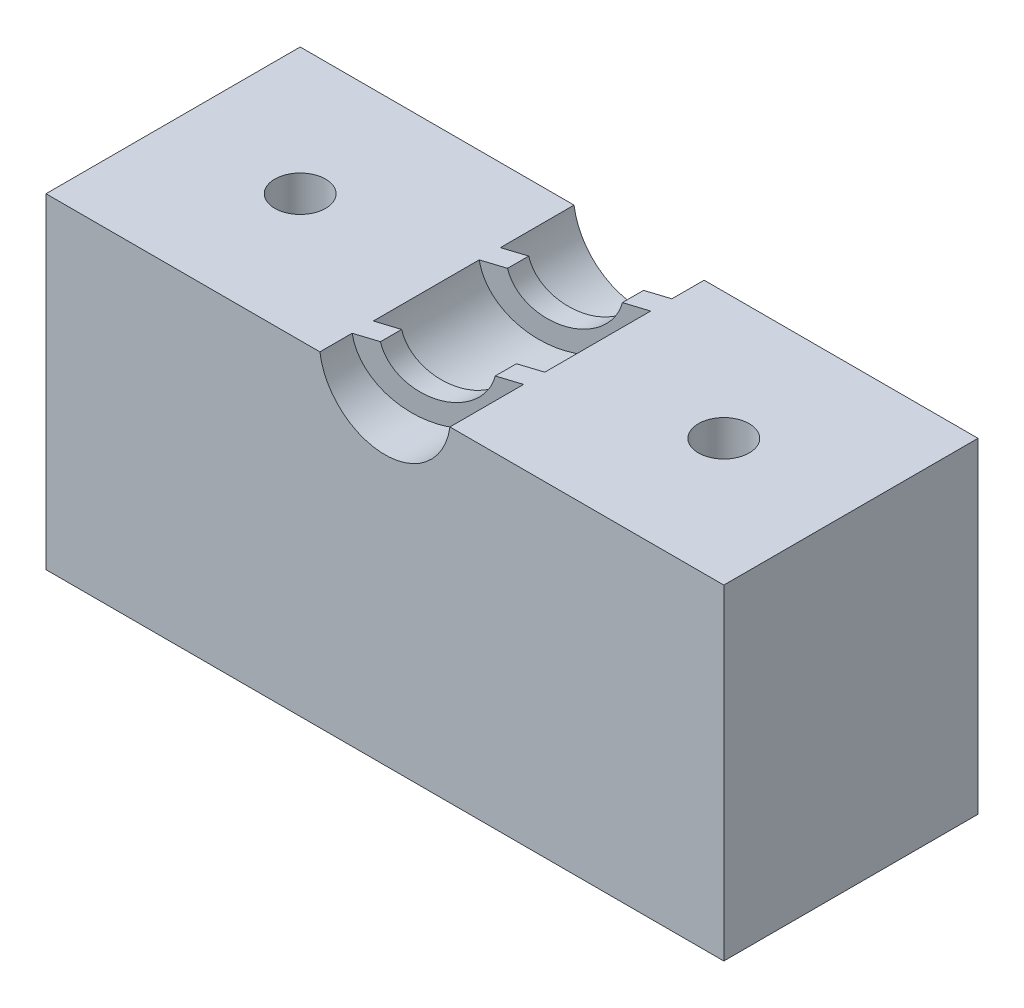
ISO-10303-21;
HEADER;
FILE_DESCRIPTION(('STEP AP214'),'2;1');
FILE_NAME('part.step','',(''),(''),'','','');
FILE_SCHEMA(('AUTOMOTIVE_DESIGN { 1 0 10303 214 1 1 1 1 }'));
ENDSEC;
DATA;
#1=APPLICATION_CONTEXT('core data for automotive mechanical design processes');
#2=APPLICATION_PROTOCOL_DEFINITION('international standard','automotive_design',2000,#1);
#3=PRODUCT_CONTEXT('',#1,'mechanical');
#4=PRODUCT('Part','Part','',(#3));
#5=PRODUCT_RELATED_PRODUCT_CATEGORY('part','',(#4));
#6=PRODUCT_DEFINITION_FORMATION('','',#4);
#7=PRODUCT_DEFINITION_CONTEXT('part definition',#1,'design');
#8=PRODUCT_DEFINITION('design','',#6,#7);
#9=PRODUCT_DEFINITION_SHAPE('','',#8);
#10=(LENGTH_UNIT() NAMED_UNIT(*) SI_UNIT(.MILLI.,.METRE.));
#11=(NAMED_UNIT(*) PLANE_ANGLE_UNIT() SI_UNIT($,.RADIAN.));
#12=(NAMED_UNIT(*) SI_UNIT($,.STERADIAN.) SOLID_ANGLE_UNIT());
#13=UNCERTAINTY_MEASURE_WITH_UNIT(LENGTH_MEASURE(1.E-05),#10,'distance_accuracy_value','');
#14=(GEOMETRIC_REPRESENTATION_CONTEXT(3) GLOBAL_UNCERTAINTY_ASSIGNED_CONTEXT((#13)) GLOBAL_UNIT_ASSIGNED_CONTEXT((#10,
#11,#12)) REPRESENTATION_CONTEXT('',''));
#15=CARTESIAN_POINT('',(0.,0.,0.));
#16=DIRECTION('',(0.,0.,1.));
#17=DIRECTION('',(1.,0.,0.));
#18=AXIS2_PLACEMENT_3D('',#15,#16,#17);
#19=CARTESIAN_POINT('',(0.,0.,3.));
#20=DIRECTION('',(0.,0.,-1.));
#21=DIRECTION('',(-1.,0.,0.));
#22=AXIS2_PLACEMENT_3D('',#19,#20,#21);
#23=PLANE('',#22);
#24=DIRECTION('',(-1.,0.,0.));
#25=VECTOR('',#24,1.);
#26=CARTESIAN_POINT('',(8.,-7.9,3.));
#27=LINE('',#26,#25);
#28=CARTESIAN_POINT('',(8.,-7.9,3.));
#29=VERTEX_POINT('',#28);
#30=CARTESIAN_POINT('',(-8.,-7.9,3.));
#31=VERTEX_POINT('',#30);
#32=EDGE_CURVE('E146',#29,#31,#27,.T.);
#33=ORIENTED_EDGE('',*,*,#32,.F.);
#34=DIRECTION('',(0.,1.,0.));
#35=VECTOR('',#34,1.);
#36=CARTESIAN_POINT('',(8.,-8.,3.));
#37=LINE('',#36,#35);
#38=CARTESIAN_POINT('',(8.,-0.214092960547071,3.));
#39=VERTEX_POINT('',#38);
#40=EDGE_CURVE('E169',#29,#39,#37,.T.);
#41=ORIENTED_EDGE('',*,*,#40,.T.);
#42=DIRECTION('',(1.,0.,0.));
#43=VECTOR('',#42,1.);
#44=CARTESIAN_POINT('',(0.,-0.214092960547071,3.));
#45=LINE('',#44,#43);
#46=CARTESIAN_POINT('',(1.53514305660554,-0.214092960547071,3.));
#47=VERTEX_POINT('',#46);
#48=EDGE_CURVE('E199',#47,#39,#45,.T.);
#49=ORIENTED_EDGE('',*,*,#48,.F.);
#50=CARTESIAN_POINT('',(0.,0.,3.));
#51=DIRECTION('',(0.,0.,1.));
#52=DIRECTION('',(1.,0.,0.));
#53=AXIS2_PLACEMENT_3D('',#50,#51,#52);
#54=CIRCLE('',#53,1.55);
#55=CARTESIAN_POINT('',(-1.53514305660554,-0.214092960547071,3.));
#56=VERTEX_POINT('',#55);
#57=EDGE_CURVE('E175',#56,#47,#54,.T.);
#58=ORIENTED_EDGE('',*,*,#57,.F.);
#59=DIRECTION('',(-1.,0.,0.));
#60=VECTOR('',#59,1.);
#61=CARTESIAN_POINT('',(0.,-0.214092960547071,3.));
#62=LINE('',#61,#60);
#63=CARTESIAN_POINT('',(-8.,-0.214092960547072,3.));
#64=VERTEX_POINT('',#63);
#65=EDGE_CURVE('E207',#56,#64,#62,.T.);
#66=ORIENTED_EDGE('',*,*,#65,.T.);
#67=DIRECTION('',(0.,-1.,0.));
#68=VECTOR('',#67,1.);
#69=CARTESIAN_POINT('',(-8.,-8.,3.));
#70=LINE('',#69,#68);
#71=EDGE_CURVE('E173',#64,#31,#70,.T.);
#72=ORIENTED_EDGE('',*,*,#71,.T.);
#73=EDGE_LOOP('',(#33,#41,#49,#58,#66,#72));
#74=FACE_BOUND('',#73,.T.);
#75=ADVANCED_FACE('F41',(#74),#23,.F.);
#76=CARTESIAN_POINT('',(0.,0.,-3.));
#77=DIRECTION('',(0.,0.,-1.));
#78=DIRECTION('',(-1.,0.,0.));
#79=AXIS2_PLACEMENT_3D('',#76,#77,#78);
#80=PLANE('',#79);
#81=DIRECTION('',(0.,1.,0.));
#82=VECTOR('',#81,1.);
#83=CARTESIAN_POINT('',(8.,-8.,-3.));
#84=LINE('',#83,#82);
#85=CARTESIAN_POINT('',(8.,-7.9,-3.));
#86=VERTEX_POINT('',#85);
#87=CARTESIAN_POINT('',(8.,-0.214092960547071,-3.));
#88=VERTEX_POINT('',#87);
#89=EDGE_CURVE('E161',#86,#88,#84,.T.);
#90=ORIENTED_EDGE('',*,*,#89,.F.);
#91=DIRECTION('',(1.,0.,0.));
#92=VECTOR('',#91,1.);
#93=CARTESIAN_POINT('',(-8.,-7.9,-3.));
#94=LINE('',#93,#92);
#95=CARTESIAN_POINT('',(-8.,-7.9,-3.));
#96=VERTEX_POINT('',#95);
#97=EDGE_CURVE('E59',#96,#86,#94,.T.);
#98=ORIENTED_EDGE('',*,*,#97,.F.);
#99=DIRECTION('',(0.,-1.,0.));
#100=VECTOR('',#99,1.);
#101=CARTESIAN_POINT('',(-8.,-8.,-3.));
#102=LINE('',#101,#100);
#103=CARTESIAN_POINT('',(-8.,-0.214092960547072,-3.));
#104=VERTEX_POINT('',#103);
#105=EDGE_CURVE('E159',#104,#96,#102,.T.);
#106=ORIENTED_EDGE('',*,*,#105,.F.);
#107=DIRECTION('',(-1.,0.,0.));
#108=VECTOR('',#107,1.);
#109=CARTESIAN_POINT('',(0.,-0.214092960547071,-3.));
#110=LINE('',#109,#108);
#111=CARTESIAN_POINT('',(-1.53514305660554,-0.214092960547071,-3.));
#112=VERTEX_POINT('',#111);
#113=EDGE_CURVE('E214',#112,#104,#110,.T.);
#114=ORIENTED_EDGE('',*,*,#113,.F.);
#115=CARTESIAN_POINT('',(0.,0.,-3.));
#116=DIRECTION('',(0.,0.,1.));
#117=DIRECTION('',(1.,0.,0.));
#118=AXIS2_PLACEMENT_3D('',#115,#116,#117);
#119=CIRCLE('',#118,1.55);
#120=CARTESIAN_POINT('',(1.53514305660554,-0.214092960547071,-3.));
#121=VERTEX_POINT('',#120);
#122=EDGE_CURVE('E282',#112,#121,#119,.T.);
#123=ORIENTED_EDGE('',*,*,#122,.T.);
#124=DIRECTION('',(1.,0.,0.));
#125=VECTOR('',#124,1.);
#126=CARTESIAN_POINT('',(0.,-0.214092960547071,-3.));
#127=LINE('',#126,#125);
#128=EDGE_CURVE('E211',#121,#88,#127,.T.);
#129=ORIENTED_EDGE('',*,*,#128,.T.);
#130=EDGE_LOOP('',(#90,#98,#106,#114,#123,#129));
#131=FACE_BOUND('',#130,.T.);
#132=ADVANCED_FACE('F157',(#131),#80,.T.);
#133=CARTESIAN_POINT('',(-8.,-8.,3.));
#134=DIRECTION('',(1.,0.,0.));
#135=DIRECTION('',(0.,0.,-1.));
#136=AXIS2_PLACEMENT_3D('',#133,#134,#135);
#137=PLANE('',#136);
#138=DIRECTION('',(0.,0.,-1.));
#139=VECTOR('',#138,1.);
#140=CARTESIAN_POINT('',(-8.,-7.9,3.));
#141=LINE('',#140,#139);
#142=EDGE_CURVE('E143',#31,#96,#141,.T.);
#143=ORIENTED_EDGE('',*,*,#142,.F.);
#144=ORIENTED_EDGE('',*,*,#71,.F.);
#145=DIRECTION('',(0.,0.,1.));
#146=VECTOR('',#145,1.);
#147=CARTESIAN_POINT('',(-8.,-0.214092960547072,-3.));
#148=LINE('',#147,#146);
#149=EDGE_CURVE('E167',#104,#64,#148,.T.);
#150=ORIENTED_EDGE('',*,*,#149,.F.);
#151=ORIENTED_EDGE('',*,*,#105,.T.);
#152=EDGE_LOOP('',(#143,#144,#150,#151));
#153=FACE_BOUND('',#152,.T.);
#154=ADVANCED_FACE('F166',(#153),#137,.F.);
#155=CARTESIAN_POINT('',(8.,-8.,3.));
#156=DIRECTION('',(-1.,0.,0.));
#157=DIRECTION('',(0.,0.,1.));
#158=AXIS2_PLACEMENT_3D('',#155,#156,#157);
#159=PLANE('',#158);
#160=DIRECTION('',(0.,0.,1.));
#161=VECTOR('',#160,1.);
#162=CARTESIAN_POINT('',(8.,-7.9,-3.));
#163=LINE('',#162,#161);
#164=EDGE_CURVE('E163',#86,#29,#163,.T.);
#165=ORIENTED_EDGE('',*,*,#164,.F.);
#166=ORIENTED_EDGE('',*,*,#89,.T.);
#167=DIRECTION('',(0.,0.,1.));
#168=VECTOR('',#167,1.);
#169=CARTESIAN_POINT('',(8.,-0.214092960547071,-3.));
#170=LINE('',#169,#168);
#171=EDGE_CURVE('E225',#88,#39,#170,.T.);
#172=ORIENTED_EDGE('',*,*,#171,.T.);
#173=ORIENTED_EDGE('',*,*,#40,.F.);
#174=EDGE_LOOP('',(#165,#166,#172,#173));
#175=FACE_BOUND('',#174,.T.);
#176=ADVANCED_FACE('F43',(#175),#159,.F.);
#177=CARTESIAN_POINT('',(5.,-8.,0.));
#178=DIRECTION('',(0.,1.,0.));
#179=DIRECTION('',(0.,0.,1.));
#180=AXIS2_PLACEMENT_3D('',#177,#178,#179);
#181=CYLINDRICAL_SURFACE('',#180,0.6);
#182=CARTESIAN_POINT('',(5.,-0.214092960547071,0.));
#183=DIRECTION('',(0.,-1.,0.));
#184=DIRECTION('',(1.,0.,0.));
#185=AXIS2_PLACEMENT_3D('',#182,#183,#184);
#186=CIRCLE('',#185,0.6);
#187=CARTESIAN_POINT('',(5.6,-0.214092960547071,0.));
#188=VERTEX_POINT('',#187);
#189=EDGE_CURVE('E191',#188,#188,#186,.T.);
#190=ORIENTED_EDGE('',*,*,#189,.F.);
#191=EDGE_LOOP('',(#190));
#192=FACE_BOUND('',#191,.T.);
#193=CARTESIAN_POINT('',(5.,-7.9,0.));
#194=DIRECTION('',(0.,-1.,0.));
#195=DIRECTION('',(0.,0.,-1.));
#196=AXIS2_PLACEMENT_3D('',#193,#194,#195);
#197=CIRCLE('',#196,0.6);
#198=CARTESIAN_POINT('',(5.,-7.9,-0.600000000000001));
#199=VERTEX_POINT('',#198);
#200=EDGE_CURVE('E474',#199,#199,#197,.T.);
#201=ORIENTED_EDGE('',*,*,#200,.T.);
#202=EDGE_LOOP('',(#201));
#203=FACE_BOUND('',#202,.T.);
#204=ADVANCED_FACE('F355',(#192,#203),#181,.F.);
#205=CARTESIAN_POINT('',(-5.,-8.,0.));
#206=DIRECTION('',(0.,1.,0.));
#207=DIRECTION('',(0.,0.,1.));
#208=AXIS2_PLACEMENT_3D('',#205,#206,#207);
#209=CYLINDRICAL_SURFACE('',#208,0.6);
#210=CARTESIAN_POINT('',(-5.,-0.214092960547072,0.));
#211=DIRECTION('',(0.,1.,0.));
#212=DIRECTION('',(-1.,0.,0.));
#213=AXIS2_PLACEMENT_3D('',#210,#211,#212);
#214=CIRCLE('',#213,0.6);
#215=CARTESIAN_POINT('',(-5.6,-0.214092960547072,0.));
#216=VERTEX_POINT('',#215);
#217=EDGE_CURVE('E45',#216,#216,#214,.T.);
#218=ORIENTED_EDGE('',*,*,#217,.T.);
#219=EDGE_LOOP('',(#218));
#220=FACE_BOUND('',#219,.T.);
#221=CARTESIAN_POINT('',(-5.,-7.9,0.));
#222=DIRECTION('',(0.,-1.,0.));
#223=DIRECTION('',(0.,0.,-1.));
#224=AXIS2_PLACEMENT_3D('',#221,#222,#223);
#225=CIRCLE('',#224,0.6);
#226=CARTESIAN_POINT('',(-5.,-7.9,-0.6));
#227=VERTEX_POINT('',#226);
#228=EDGE_CURVE('E152',#227,#227,#225,.T.);
#229=ORIENTED_EDGE('',*,*,#228,.T.);
#230=EDGE_LOOP('',(#229));
#231=FACE_BOUND('',#230,.T.);
#232=ADVANCED_FACE('F360',(#220,#231),#209,.F.);
#233=CARTESIAN_POINT('',(0.,0.,3.));
#234=DIRECTION('',(0.,0.,-1.));
#235=DIRECTION('',(-1.,0.,0.));
#236=AXIS2_PLACEMENT_3D('',#233,#234,#235);
#237=CYLINDRICAL_SURFACE('',#236,1.55);
#238=ORIENTED_EDGE('',*,*,#122,.F.);
#239=DIRECTION('',(0.,0.,-1.));
#240=VECTOR('',#239,1.);
#241=CARTESIAN_POINT('',(-1.53514305660554,-0.214092960547071,3.));
#242=LINE('',#241,#240);
#243=CARTESIAN_POINT('',(-1.53514305660554,-0.214092960547072,-1.26125398185195));
#244=VERTEX_POINT('',#243);
#245=EDGE_CURVE('E247',#112,#244,#242,.F.);
#246=ORIENTED_EDGE('',*,*,#245,.T.);
#247=CARTESIAN_POINT('',(0.,0.,-1.75));
#248=DIRECTION('',(-0.303367903708314,0.,-0.952873504196451));
#249=DIRECTION('',(0.952873504196451,0.,-0.303367903708314));
#250=AXIS2_PLACEMENT_3D('',#247,#248,#249);
#251=ELLIPSE('',#250,1.62665872560608,1.55);
#252=CARTESIAN_POINT('',(1.53514305660553,-0.214092960547071,-2.23874601814805));
#253=VERTEX_POINT('',#252);
#254=EDGE_CURVE('E274',#253,#244,#251,.T.);
#255=ORIENTED_EDGE('',*,*,#254,.F.);
#256=DIRECTION('',(0.,0.,-1.));
#257=VECTOR('',#256,1.);
#258=CARTESIAN_POINT('',(1.53514305660554,-0.214092960547071,3.));
#259=LINE('',#258,#257);
#260=EDGE_CURVE('E232',#121,#253,#259,.F.);
#261=ORIENTED_EDGE('',*,*,#260,.F.);
#262=EDGE_LOOP('',(#238,#246,#255,#261));
#263=FACE_BOUND('',#262,.T.);
#264=ADVANCED_FACE('F340',(#263),#237,.F.);
#265=CARTESIAN_POINT('',(0.,0.,1.75));
#266=DIRECTION('',(0.303367903708314,0.,0.952873504196451));
#267=DIRECTION('',(0.952873504196451,0.,-0.303367903708314));
#268=AXIS2_PLACEMENT_3D('',#265,#266,#267);
#269=ELLIPSE('',#268,1.62665872560608,1.55);
#270=CARTESIAN_POINT('',(-1.53514305660554,-0.214092960547072,2.23874601814805));
#271=VERTEX_POINT('',#270);
#272=CARTESIAN_POINT('',(1.53514305660553,-0.214092960547071,1.26125398185195));
#273=VERTEX_POINT('',#272);
#274=EDGE_CURVE('E179',#271,#273,#269,.T.);
#275=ORIENTED_EDGE('',*,*,#274,.F.);
#276=EDGE_CURVE('E252',#271,#56,#242,.F.);
#277=ORIENTED_EDGE('',*,*,#276,.T.);
#278=ORIENTED_EDGE('',*,*,#57,.T.);
#279=EDGE_CURVE('E236',#273,#47,#259,.F.);
#280=ORIENTED_EDGE('',*,*,#279,.F.);
#281=EDGE_LOOP('',(#275,#277,#278,#280));
#282=FACE_BOUND('',#281,.T.);
#283=ADVANCED_FACE('F298',(#282),#237,.F.);
#284=CARTESIAN_POINT('',(0.505874665567726,-11.4381719755756,1.58894385124934));
#285=DIRECTION('',(0.303367903708314,0.,0.952873504196451));
#286=DIRECTION('',(0.952873504196451,0.,-0.303367903708314));
#287=AXIS2_PLACEMENT_3D('',#284,#285,#286);
#288=PLANE('',#287);
#289=CARTESIAN_POINT('',(0.,0.,1.75));
#290=DIRECTION('',(0.303367903708314,0.,0.952873504196451));
#291=DIRECTION('',(-0.952873504196451,0.,0.303367903708314));
#292=AXIS2_PLACEMENT_3D('',#289,#290,#291);
#293=ELLIPSE('',#292,1.10193010444283,1.05);
#294=CARTESIAN_POINT('',(-1.02794173193046,-0.214092960547071,2.07726749875684));
#295=VERTEX_POINT('',#294);
#296=CARTESIAN_POINT('',(1.02794173193046,-0.214092960547071,1.42273250124316));
#297=VERTEX_POINT('',#296);
#298=EDGE_CURVE('E267',#295,#297,#293,.T.);
#299=ORIENTED_EDGE('',*,*,#298,.F.);
#300=DIRECTION('',(-0.952873504196451,0.,0.303367903708314));
#301=VECTOR('',#300,1.);
#302=CARTESIAN_POINT('',(0.505874665567725,-0.214092960547071,1.58894385124934));
#303=LINE('',#302,#301);
#304=EDGE_CURVE('E260',#295,#271,#303,.T.);
#305=ORIENTED_EDGE('',*,*,#304,.T.);
#306=ORIENTED_EDGE('',*,*,#274,.T.);
#307=DIRECTION('',(0.952873504196451,0.,-0.303367903708314));
#308=VECTOR('',#307,1.);
#309=CARTESIAN_POINT('',(0.505874665567726,-0.214092960547071,1.58894385124934));
#310=LINE('',#309,#308);
#311=EDGE_CURVE('E244',#297,#273,#310,.T.);
#312=ORIENTED_EDGE('',*,*,#311,.F.);
#313=EDGE_LOOP('',(#299,#305,#306,#312));
#314=FACE_BOUND('',#313,.T.);
#315=ADVANCED_FACE('F319',(#314),#288,.T.);
#316=CARTESIAN_POINT('',(-0.505874665567727,-11.4381719755756,-1.58894385124934));
#317=DIRECTION('',(-0.303367903708314,0.,-0.952873504196451));
#318=DIRECTION('',(-0.952873504196451,0.,0.303367903708314));
#319=AXIS2_PLACEMENT_3D('',#316,#317,#318);
#320=PLANE('',#319);
#321=ORIENTED_EDGE('',*,*,#254,.T.);
#322=DIRECTION('',(0.952873504196451,0.,-0.303367903708314));
#323=VECTOR('',#322,1.);
#324=CARTESIAN_POINT('',(-0.505874665567728,-0.214092960547071,-1.58894385124934));
#325=LINE('',#324,#323);
#326=CARTESIAN_POINT('',(-1.02794173193046,-0.214092960547071,-1.42273250124316));
#327=VERTEX_POINT('',#326);
#328=EDGE_CURVE('E11',#244,#327,#325,.T.);
#329=ORIENTED_EDGE('',*,*,#328,.T.);
#330=CARTESIAN_POINT('',(0.,0.,-1.75));
#331=DIRECTION('',(-0.303367903708314,0.,-0.952873504196451));
#332=DIRECTION('',(-0.952873504196451,0.,0.303367903708314));
#333=AXIS2_PLACEMENT_3D('',#330,#331,#332);
#334=ELLIPSE('',#333,1.10193010444283,1.05);
#335=CARTESIAN_POINT('',(1.02794173193046,-0.214092960547071,-2.07726749875684));
#336=VERTEX_POINT('',#335);
#337=EDGE_CURVE('E51',#336,#327,#334,.T.);
#338=ORIENTED_EDGE('',*,*,#337,.F.);
#339=DIRECTION('',(-0.952873504196451,0.,0.303367903708314));
#340=VECTOR('',#339,1.);
#341=CARTESIAN_POINT('',(-0.505874665567727,-0.214092960547071,-1.58894385124934));
#342=LINE('',#341,#340);
#343=EDGE_CURVE('E187',#253,#336,#342,.T.);
#344=ORIENTED_EDGE('',*,*,#343,.F.);
#345=EDGE_LOOP('',(#321,#329,#338,#344));
#346=FACE_BOUND('',#345,.T.);
#347=ADVANCED_FACE('F370',(#346),#320,.T.);
#348=CARTESIAN_POINT('',(0.,0.,-3.));
#349=DIRECTION('',(0.,0.,1.));
#350=DIRECTION('',(1.,0.,0.));
#351=AXIS2_PLACEMENT_3D('',#348,#349,#350);
#352=CYLINDRICAL_SURFACE('',#351,1.05);
#353=DIRECTION('',(0.,0.,1.));
#354=VECTOR('',#353,1.);
#355=CARTESIAN_POINT('',(-1.02794173193046,-0.214092960547071,-3.));
#356=LINE('',#355,#354);
#357=CARTESIAN_POINT('',(-1.02794173193046,-0.214092960547071,1.57726749875684));
#358=VERTEX_POINT('',#357);
#359=EDGE_CURVE('E218',#358,#295,#356,.T.);
#360=ORIENTED_EDGE('',*,*,#359,.T.);
#361=ORIENTED_EDGE('',*,*,#298,.T.);
#362=DIRECTION('',(0.,0.,1.));
#363=VECTOR('',#362,1.);
#364=CARTESIAN_POINT('',(1.02794173193046,-0.214092960547071,-3.));
#365=LINE('',#364,#363);
#366=CARTESIAN_POINT('',(1.02794173193046,-0.214092960547071,0.92273250124316));
#367=VERTEX_POINT('',#366);
#368=EDGE_CURVE('E217',#367,#297,#365,.T.);
#369=ORIENTED_EDGE('',*,*,#368,.F.);
#370=CARTESIAN_POINT('',(0.,0.,1.25));
#371=DIRECTION('',(0.303367903708314,0.,0.952873504196451));
#372=DIRECTION('',(-0.952873504196451,0.,0.303367903708314));
#373=AXIS2_PLACEMENT_3D('',#370,#371,#372);
#374=ELLIPSE('',#373,1.10193010444283,1.05);
#375=EDGE_CURVE('E270',#358,#367,#374,.T.);
#376=ORIENTED_EDGE('',*,*,#375,.F.);
#377=EDGE_LOOP('',(#360,#361,#369,#376));
#378=FACE_BOUND('',#377,.T.);
#379=ADVANCED_FACE('F315',(#378),#352,.F.);
#380=CARTESIAN_POINT('',(0.,-0.214092960547071,-3.));
#381=DIRECTION('',(0.,1.,0.));
#382=DIRECTION('',(-1.,0.,0.));
#383=AXIS2_PLACEMENT_3D('',#380,#381,#382);
#384=PLANE('',#383);
#385=ORIENTED_EDGE('',*,*,#217,.F.);
#386=EDGE_LOOP('',(#385));
#387=FACE_BOUND('',#386,.T.);
#388=ORIENTED_EDGE('',*,*,#304,.F.);
#389=ORIENTED_EDGE('',*,*,#359,.F.);
#390=DIRECTION('',(-0.952873504196451,0.,0.303367903708314));
#391=VECTOR('',#390,1.);
#392=CARTESIAN_POINT('',(0.361339046834089,-0.214092960547071,1.13495989374953));
#393=LINE('',#392,#391);
#394=CARTESIAN_POINT('',(-1.53514305660554,-0.214092960547071,1.73874601814805));
#395=VERTEX_POINT('',#394);
#396=EDGE_CURVE('E257',#358,#395,#393,.T.);
#397=ORIENTED_EDGE('',*,*,#396,.T.);
#398=CARTESIAN_POINT('',(-1.53514305660554,-0.214092960547072,-0.76125398185195));
#399=VERTEX_POINT('',#398);
#400=EDGE_CURVE('E253',#399,#395,#242,.F.);
#401=ORIENTED_EDGE('',*,*,#400,.F.);
#402=DIRECTION('',(-0.952873504196451,0.,0.303367903708314));
#403=VECTOR('',#402,1.);
#404=CARTESIAN_POINT('',(-0.361339046834092,-0.214092960547071,-1.13495989374953));
#405=LINE('',#404,#403);
#406=CARTESIAN_POINT('',(-1.02794173193046,-0.214092960547071,-0.922732501243162));
#407=VERTEX_POINT('',#406);
#408=EDGE_CURVE('E251',#407,#399,#405,.T.);
#409=ORIENTED_EDGE('',*,*,#408,.F.);
#410=EDGE_CURVE('E222',#327,#407,#356,.T.);
#411=ORIENTED_EDGE('',*,*,#410,.F.);
#412=ORIENTED_EDGE('',*,*,#328,.F.);
#413=ORIENTED_EDGE('',*,*,#245,.F.);
#414=ORIENTED_EDGE('',*,*,#113,.T.);
#415=ORIENTED_EDGE('',*,*,#149,.T.);
#416=ORIENTED_EDGE('',*,*,#65,.F.);
#417=ORIENTED_EDGE('',*,*,#276,.F.);
#418=EDGE_LOOP('',(#388,#389,#397,#401,#409,#411,#412,#413,#414,#415,#416,#417));
#419=FACE_BOUND('',#418,.T.);
#420=ADVANCED_FACE('F295',(#387,#419),#384,.T.);
#421=CARTESIAN_POINT('',(0.,-0.214092960547071,-3.));
#422=DIRECTION('',(0.,-1.,0.));
#423=DIRECTION('',(1.,0.,0.));
#424=AXIS2_PLACEMENT_3D('',#421,#422,#423);
#425=PLANE('',#424);
#426=ORIENTED_EDGE('',*,*,#189,.T.);
#427=EDGE_LOOP('',(#426));
#428=FACE_BOUND('',#427,.T.);
#429=ORIENTED_EDGE('',*,*,#279,.T.);
#430=ORIENTED_EDGE('',*,*,#48,.T.);
#431=ORIENTED_EDGE('',*,*,#171,.F.);
#432=ORIENTED_EDGE('',*,*,#128,.F.);
#433=ORIENTED_EDGE('',*,*,#260,.T.);
#434=ORIENTED_EDGE('',*,*,#343,.T.);
#435=CARTESIAN_POINT('',(1.02794173193046,-0.214092960547071,-1.57726749875684));
#436=VERTEX_POINT('',#435);
#437=EDGE_CURVE('E67',#336,#436,#365,.T.);
#438=ORIENTED_EDGE('',*,*,#437,.T.);
#439=DIRECTION('',(0.952873504196451,0.,-0.303367903708314));
#440=VECTOR('',#439,1.);
#441=CARTESIAN_POINT('',(-0.361339046834091,-0.214092960547071,-1.13495989374953));
#442=LINE('',#441,#440);
#443=CARTESIAN_POINT('',(1.53514305660554,-0.214092960547071,-1.73874601814805));
#444=VERTEX_POINT('',#443);
#445=EDGE_CURVE('E235',#436,#444,#442,.T.);
#446=ORIENTED_EDGE('',*,*,#445,.T.);
#447=CARTESIAN_POINT('',(1.53514305660554,-0.214092960547071,0.761253981851949));
#448=VERTEX_POINT('',#447);
#449=EDGE_CURVE('E237',#444,#448,#259,.F.);
#450=ORIENTED_EDGE('',*,*,#449,.T.);
#451=DIRECTION('',(0.952873504196451,0.,-0.303367903708314));
#452=VECTOR('',#451,1.);
#453=CARTESIAN_POINT('',(0.36133904683409,-0.214092960547071,1.13495989374953));
#454=LINE('',#453,#452);
#455=EDGE_CURVE('E240',#367,#448,#454,.T.);
#456=ORIENTED_EDGE('',*,*,#455,.F.);
#457=ORIENTED_EDGE('',*,*,#368,.T.);
#458=ORIENTED_EDGE('',*,*,#311,.T.);
#459=EDGE_LOOP('',(#429,#430,#431,#432,#433,#434,#438,#446,#450,#456,#457,#458));
#460=FACE_BOUND('',#459,.T.);
#461=ADVANCED_FACE('F312',(#428,#460),#425,.F.);
#462=CARTESIAN_POINT('',(0.,0.,-1.25));
#463=DIRECTION('',(0.303367903708314,0.,0.952873504196451));
#464=DIRECTION('',(-0.952873504196451,0.,0.303367903708314));
#465=AXIS2_PLACEMENT_3D('',#462,#463,#464);
#466=ELLIPSE('',#465,1.10193010444283,1.05);
#467=EDGE_CURVE('E264',#407,#436,#466,.T.);
#468=ORIENTED_EDGE('',*,*,#467,.T.);
#469=ORIENTED_EDGE('',*,*,#437,.F.);
#470=ORIENTED_EDGE('',*,*,#337,.T.);
#471=ORIENTED_EDGE('',*,*,#410,.T.);
#472=EDGE_LOOP('',(#468,#469,#470,#471));
#473=FACE_BOUND('',#472,.T.);
#474=ADVANCED_FACE('F328',(#473),#352,.F.);
#475=CARTESIAN_POINT('',(0.36133904683409,-11.4381719755756,1.13495989374953));
#476=DIRECTION('',(0.303367903708314,0.,0.952873504196451));
#477=DIRECTION('',(0.952873504196451,0.,-0.303367903708314));
#478=AXIS2_PLACEMENT_3D('',#475,#476,#477);
#479=PLANE('',#478);
#480=ORIENTED_EDGE('',*,*,#396,.F.);
#481=ORIENTED_EDGE('',*,*,#375,.T.);
#482=ORIENTED_EDGE('',*,*,#455,.T.);
#483=CARTESIAN_POINT('',(0.,0.,1.25));
#484=DIRECTION('',(0.303367903708314,0.,0.952873504196451));
#485=DIRECTION('',(0.952873504196451,0.,-0.303367903708314));
#486=AXIS2_PLACEMENT_3D('',#483,#484,#485);
#487=ELLIPSE('',#486,1.62665872560608,1.55);
#488=EDGE_CURVE('E183',#395,#448,#487,.T.);
#489=ORIENTED_EDGE('',*,*,#488,.F.);
#490=EDGE_LOOP('',(#480,#481,#482,#489));
#491=FACE_BOUND('',#490,.T.);
#492=ADVANCED_FACE('F310',(#491),#479,.F.);
#493=CARTESIAN_POINT('',(-0.361339046834091,-11.4381719755756,-1.13495989374953));
#494=DIRECTION('',(0.303367903708314,0.,0.952873504196451));
#495=DIRECTION('',(0.952873504196451,0.,-0.303367903708314));
#496=AXIS2_PLACEMENT_3D('',#493,#494,#495);
#497=PLANE('',#496);
#498=ORIENTED_EDGE('',*,*,#467,.F.);
#499=ORIENTED_EDGE('',*,*,#408,.T.);
#500=CARTESIAN_POINT('',(0.,0.,-1.25));
#501=DIRECTION('',(0.303367903708314,0.,0.952873504196451));
#502=DIRECTION('',(0.952873504196451,0.,-0.303367903708314));
#503=AXIS2_PLACEMENT_3D('',#500,#501,#502);
#504=ELLIPSE('',#503,1.62665872560608,1.55);
#505=EDGE_CURVE('E278',#399,#444,#504,.T.);
#506=ORIENTED_EDGE('',*,*,#505,.T.);
#507=ORIENTED_EDGE('',*,*,#445,.F.);
#508=EDGE_LOOP('',(#498,#499,#506,#507));
#509=FACE_BOUND('',#508,.T.);
#510=ADVANCED_FACE('F332',(#509),#497,.T.);
#511=ORIENTED_EDGE('',*,*,#505,.F.);
#512=ORIENTED_EDGE('',*,*,#400,.T.);
#513=ORIENTED_EDGE('',*,*,#488,.T.);
#514=ORIENTED_EDGE('',*,*,#449,.F.);
#515=EDGE_LOOP('',(#511,#512,#513,#514));
#516=FACE_BOUND('',#515,.T.);
#517=ADVANCED_FACE('F306',(#516),#237,.F.);
#518=CARTESIAN_POINT('',(0.,-7.9,0.));
#519=DIRECTION('',(0.,-1.,0.));
#520=DIRECTION('',(0.,0.,-1.));
#521=AXIS2_PLACEMENT_3D('',#518,#519,#520);
#522=PLANE('',#521);
#523=ORIENTED_EDGE('',*,*,#200,.F.);
#524=EDGE_LOOP('',(#523));
#525=FACE_BOUND('',#524,.T.);
#526=ORIENTED_EDGE('',*,*,#228,.F.);
#527=EDGE_LOOP('',(#526));
#528=FACE_BOUND('',#527,.T.);
#529=ORIENTED_EDGE('',*,*,#142,.T.);
#530=ORIENTED_EDGE('',*,*,#97,.T.);
#531=ORIENTED_EDGE('',*,*,#164,.T.);
#532=ORIENTED_EDGE('',*,*,#32,.T.);
#533=EDGE_LOOP('',(#529,#530,#531,#532));
#534=FACE_BOUND('',#533,.T.);
#535=ADVANCED_FACE('F144',(#525,#528,#534),#522,.T.);
#536=CLOSED_SHELL('',(#75,#132,#154,#176,#204,#232,#264,#283,#315,#347,#379,#420,#461,#474,#492,
#510,#517,#535));
#537=MANIFOLD_SOLID_BREP('B2',#536);
#538=ADVANCED_BREP_SHAPE_REPRESENTATION('',(#18,#537),#14);
#539=SHAPE_DEFINITION_REPRESENTATION(#9,#538);
ENDSEC;
END-ISO-10303-21;
